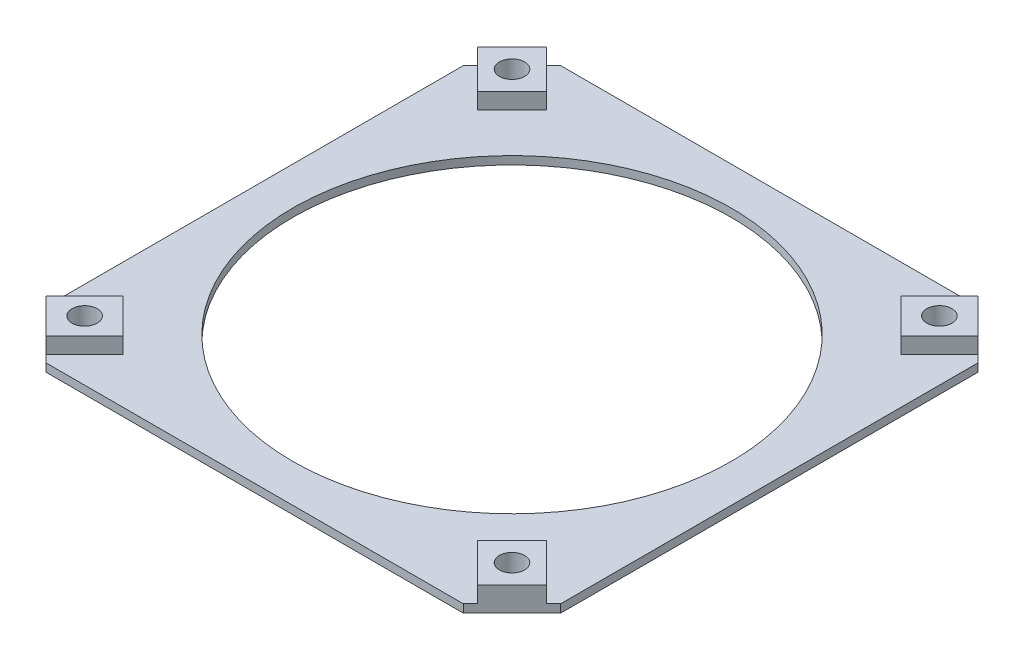
ISO-10303-21;
HEADER;
FILE_DESCRIPTION(('STEP AP214'),'2;1');
FILE_NAME('part.step','',(''),(''),'','','');
FILE_SCHEMA(('AUTOMOTIVE_DESIGN { 1 0 10303 214 1 1 1 1 }'));
ENDSEC;
DATA;
#1=APPLICATION_CONTEXT('core data for automotive mechanical design processes');
#2=APPLICATION_PROTOCOL_DEFINITION('international standard','automotive_design',2000,#1);
#3=PRODUCT_CONTEXT('',#1,'mechanical');
#4=PRODUCT('Part','Part','',(#3));
#5=PRODUCT_RELATED_PRODUCT_CATEGORY('part','',(#4));
#6=PRODUCT_DEFINITION_FORMATION('','',#4);
#7=PRODUCT_DEFINITION_CONTEXT('part definition',#1,'design');
#8=PRODUCT_DEFINITION('design','',#6,#7);
#9=PRODUCT_DEFINITION_SHAPE('','',#8);
#10=(LENGTH_UNIT() NAMED_UNIT(*) SI_UNIT(.MILLI.,.METRE.));
#11=(NAMED_UNIT(*) PLANE_ANGLE_UNIT() SI_UNIT($,.RADIAN.));
#12=(NAMED_UNIT(*) SI_UNIT($,.STERADIAN.) SOLID_ANGLE_UNIT());
#13=UNCERTAINTY_MEASURE_WITH_UNIT(LENGTH_MEASURE(1.E-05),#10,'distance_accuracy_value','');
#14=(GEOMETRIC_REPRESENTATION_CONTEXT(3) GLOBAL_UNCERTAINTY_ASSIGNED_CONTEXT((#13)) GLOBAL_UNIT_ASSIGNED_CONTEXT((#10,
#11,#12)) REPRESENTATION_CONTEXT('',''));
#15=CARTESIAN_POINT('',(0.,0.,0.));
#16=DIRECTION('',(0.,0.,1.));
#17=DIRECTION('',(1.,0.,0.));
#18=AXIS2_PLACEMENT_3D('',#15,#16,#17);
#19=CARTESIAN_POINT('',(0.,1.,0.));
#20=DIRECTION('',(0.,1.,0.));
#21=DIRECTION('',(0.,0.,1.));
#22=AXIS2_PLACEMENT_3D('',#19,#20,#21);
#23=PLANE('',#22);
#24=CARTESIAN_POINT('',(0.,1.,0.));
#25=DIRECTION('',(0.,1.,0.));
#26=DIRECTION('',(0.,0.,1.));
#27=AXIS2_PLACEMENT_3D('',#24,#25,#26);
#28=CIRCLE('',#27,27.);
#29=CARTESIAN_POINT('',(0.,1.,27.));
#30=VERTEX_POINT('',#29);
#31=EDGE_CURVE('E320',#30,#30,#28,.T.);
#32=ORIENTED_EDGE('',*,*,#31,.F.);
#33=EDGE_LOOP('',(#32));
#34=FACE_BOUND('',#33,.T.);
#35=DIRECTION('',(0.707106781186556,0.,-0.707106781186539));
#36=VECTOR('',#35,1.);
#37=CARTESIAN_POINT('',(-21.8074241767192,1.,-26.050064863839));
#38=LINE('',#37,#36);
#39=CARTESIAN_POINT('',(-26.0500648638386,1.,-21.8074241767198));
#40=VERTEX_POINT('',#39);
#41=CARTESIAN_POINT('',(-21.8074241767192,1.,-26.050064863839));
#42=VERTEX_POINT('',#41);
#43=EDGE_CURVE('E56',#40,#42,#38,.T.);
#44=ORIENTED_EDGE('',*,*,#43,.F.);
#45=DIRECTION('',(0.707106781186541,0.,0.707106781186554));
#46=VECTOR('',#45,1.);
#47=CARTESIAN_POINT('',(-30.8013203435594,1.,-26.5586796564407));
#48=LINE('',#47,#46);
#49=CARTESIAN_POINT('',(-30.8013203435594,1.,-26.5586796564407));
#50=VERTEX_POINT('',#49);
#51=EDGE_CURVE('E401',#50,#40,#48,.T.);
#52=ORIENTED_EDGE('',*,*,#51,.F.);
#53=DIRECTION('',(-0.707106781186548,0.,0.707106781186548));
#54=VECTOR('',#53,1.);
#55=CARTESIAN_POINT('',(-25.68,1.,-31.68));
#56=LINE('',#55,#54);
#57=CARTESIAN_POINT('',(-31.68,1.,-25.68));
#58=VERTEX_POINT('',#57);
#59=EDGE_CURVE('E223',#50,#58,#56,.T.);
#60=ORIENTED_EDGE('',*,*,#59,.T.);
#61=DIRECTION('',(0.,0.,1.));
#62=VECTOR('',#61,1.);
#63=CARTESIAN_POINT('',(-31.68,1.,25.68));
#64=LINE('',#63,#62);
#65=CARTESIAN_POINT('',(-31.68,1.,25.68));
#66=VERTEX_POINT('',#65);
#67=EDGE_CURVE('E337',#58,#66,#64,.T.);
#68=ORIENTED_EDGE('',*,*,#67,.T.);
#69=DIRECTION('',(0.707106781186548,0.,0.707106781186548));
#70=VECTOR('',#69,1.);
#71=CARTESIAN_POINT('',(-25.68,1.,31.68));
#72=LINE('',#71,#70);
#73=CARTESIAN_POINT('',(-30.8013203435598,1.,26.5586796564402));
#74=VERTEX_POINT('',#73);
#75=EDGE_CURVE('E340',#66,#74,#72,.T.);
#76=ORIENTED_EDGE('',*,*,#75,.T.);
#77=DIRECTION('',(-0.707106781186553,0.,0.707106781186542));
#78=VECTOR('',#77,1.);
#79=CARTESIAN_POINT('',(-30.8013203435598,1.,26.5586796564401));
#80=LINE('',#79,#78);
#81=CARTESIAN_POINT('',(-26.0500648638389,1.,21.8074241767193));
#82=VERTEX_POINT('',#81);
#83=EDGE_CURVE('E237',#82,#74,#80,.T.);
#84=ORIENTED_EDGE('',*,*,#83,.F.);
#85=DIRECTION('',(-0.707106781186542,0.,-0.707106781186553));
#86=VECTOR('',#85,1.);
#87=CARTESIAN_POINT('',(-26.0500648638389,1.,21.8074241767193));
#88=LINE('',#87,#86);
#89=CARTESIAN_POINT('',(-21.8074241767197,1.,26.0500648638386));
#90=VERTEX_POINT('',#89);
#91=EDGE_CURVE('E227',#90,#82,#88,.T.);
#92=ORIENTED_EDGE('',*,*,#91,.F.);
#93=DIRECTION('',(0.707106781186552,0.,-0.707106781186543));
#94=VECTOR('',#93,1.);
#95=CARTESIAN_POINT('',(-26.5586796564406,1.,30.8013203435595));
#96=LINE('',#95,#94);
#97=CARTESIAN_POINT('',(-26.5586796564406,1.,30.8013203435595));
#98=VERTEX_POINT('',#97);
#99=EDGE_CURVE('E224',#98,#90,#96,.T.);
#100=ORIENTED_EDGE('',*,*,#99,.F.);
#101=CARTESIAN_POINT('',(-25.68,1.,31.68));
#102=VERTEX_POINT('',#101);
#103=EDGE_CURVE('E339',#98,#102,#72,.T.);
#104=ORIENTED_EDGE('',*,*,#103,.T.);
#105=DIRECTION('',(1.,0.,0.));
#106=VECTOR('',#105,1.);
#107=CARTESIAN_POINT('',(25.68,1.,31.68));
#108=LINE('',#107,#106);
#109=CARTESIAN_POINT('',(25.68,1.,31.68));
#110=VERTEX_POINT('',#109);
#111=EDGE_CURVE('E342',#102,#110,#108,.T.);
#112=ORIENTED_EDGE('',*,*,#111,.T.);
#113=DIRECTION('',(0.707106781186548,0.,-0.707106781186548));
#114=VECTOR('',#113,1.);
#115=CARTESIAN_POINT('',(31.68,1.,25.68));
#116=LINE('',#115,#114);
#117=CARTESIAN_POINT('',(26.5586796564403,1.,30.8013203435597));
#118=VERTEX_POINT('',#117);
#119=EDGE_CURVE('E345',#110,#118,#116,.T.);
#120=ORIENTED_EDGE('',*,*,#119,.T.);
#121=DIRECTION('',(0.707106781186545,0.,0.70710678118655));
#122=VECTOR('',#121,1.);
#123=CARTESIAN_POINT('',(26.5586796564403,1.,30.8013203435597));
#124=LINE('',#123,#122);
#125=CARTESIAN_POINT('',(21.8074241767194,1.,26.0500648638388));
#126=VERTEX_POINT('',#125);
#127=EDGE_CURVE('E264',#126,#118,#124,.T.);
#128=ORIENTED_EDGE('',*,*,#127,.F.);
#129=DIRECTION('',(-0.70710678118655,0.,0.707106781186545));
#130=VECTOR('',#129,1.);
#131=CARTESIAN_POINT('',(21.8074241767194,1.,26.0500648638388));
#132=LINE('',#131,#130);
#133=CARTESIAN_POINT('',(26.0500648638387,1.,21.8074241767196));
#134=VERTEX_POINT('',#133);
#135=EDGE_CURVE('E273',#134,#126,#132,.T.);
#136=ORIENTED_EDGE('',*,*,#135,.F.);
#137=DIRECTION('',(-0.707106781186545,0.,-0.70710678118655));
#138=VECTOR('',#137,1.);
#139=CARTESIAN_POINT('',(30.8013203435596,1.,26.5586796564405));
#140=LINE('',#139,#138);
#141=CARTESIAN_POINT('',(30.8013203435596,1.,26.5586796564405));
#142=VERTEX_POINT('',#141);
#143=EDGE_CURVE('E259',#142,#134,#140,.T.);
#144=ORIENTED_EDGE('',*,*,#143,.F.);
#145=CARTESIAN_POINT('',(31.68,1.,25.68));
#146=VERTEX_POINT('',#145);
#147=EDGE_CURVE('E344',#142,#146,#116,.T.);
#148=ORIENTED_EDGE('',*,*,#147,.T.);
#149=DIRECTION('',(0.,0.,-1.));
#150=VECTOR('',#149,1.);
#151=CARTESIAN_POINT('',(31.68,1.,25.68));
#152=LINE('',#151,#150);
#153=CARTESIAN_POINT('',(31.68,1.,-25.68));
#154=VERTEX_POINT('',#153);
#155=EDGE_CURVE('E326',#146,#154,#152,.T.);
#156=ORIENTED_EDGE('',*,*,#155,.T.);
#157=DIRECTION('',(-0.707106781186548,0.,-0.707106781186548));
#158=VECTOR('',#157,1.);
#159=CARTESIAN_POINT('',(31.68,1.,-25.68));
#160=LINE('',#159,#158);
#161=CARTESIAN_POINT('',(30.8013203435596,1.,-26.5586796564404));
#162=VERTEX_POINT('',#161);
#163=EDGE_CURVE('E331',#154,#162,#160,.T.);
#164=ORIENTED_EDGE('',*,*,#163,.T.);
#165=DIRECTION('',(0.707106781186548,0.,-0.707106781186547));
#166=VECTOR('',#165,1.);
#167=CARTESIAN_POINT('',(30.8013203435596,1.,-26.5586796564404));
#168=LINE('',#167,#166);
#169=CARTESIAN_POINT('',(26.0500648638388,1.,-21.8074241767195));
#170=VERTEX_POINT('',#169);
#171=EDGE_CURVE('E294',#170,#162,#168,.T.);
#172=ORIENTED_EDGE('',*,*,#171,.F.);
#173=DIRECTION('',(0.707106781186547,0.,0.707106781186548));
#174=VECTOR('',#173,1.);
#175=CARTESIAN_POINT('',(26.0500648638388,1.,-21.8074241767195));
#176=LINE('',#175,#174);
#177=CARTESIAN_POINT('',(21.8074241767195,1.,-26.0500648638388));
#178=VERTEX_POINT('',#177);
#179=EDGE_CURVE('E303',#178,#170,#176,.T.);
#180=ORIENTED_EDGE('',*,*,#179,.F.);
#181=DIRECTION('',(-0.707106781186547,0.,0.707106781186548));
#182=VECTOR('',#181,1.);
#183=CARTESIAN_POINT('',(26.5586796564403,1.,-30.8013203435596));
#184=LINE('',#183,#182);
#185=CARTESIAN_POINT('',(26.5586796564403,1.,-30.8013203435597));
#186=VERTEX_POINT('',#185);
#187=EDGE_CURVE('E289',#186,#178,#184,.T.);
#188=ORIENTED_EDGE('',*,*,#187,.F.);
#189=CARTESIAN_POINT('',(25.68,1.,-31.68));
#190=VERTEX_POINT('',#189);
#191=EDGE_CURVE('E329',#186,#190,#160,.T.);
#192=ORIENTED_EDGE('',*,*,#191,.T.);
#193=DIRECTION('',(-1.,0.,0.));
#194=VECTOR('',#193,1.);
#195=CARTESIAN_POINT('',(25.68,1.,-31.68));
#196=LINE('',#195,#194);
#197=CARTESIAN_POINT('',(-25.68,1.,-31.68));
#198=VERTEX_POINT('',#197);
#199=EDGE_CURVE('E333',#190,#198,#196,.T.);
#200=ORIENTED_EDGE('',*,*,#199,.T.);
#201=CARTESIAN_POINT('',(-26.5586796564401,1.,-30.8013203435599));
#202=VERTEX_POINT('',#201);
#203=EDGE_CURVE('E335',#198,#202,#56,.T.);
#204=ORIENTED_EDGE('',*,*,#203,.T.);
#205=DIRECTION('',(-0.70710678118654,0.,-0.707106781186555));
#206=VECTOR('',#205,1.);
#207=CARTESIAN_POINT('',(-26.55867965644,1.,-30.8013203435599));
#208=LINE('',#207,#206);
#209=EDGE_CURVE('E61',#42,#202,#208,.T.);
#210=ORIENTED_EDGE('',*,*,#209,.F.);
#211=EDGE_LOOP('',(#44,#52,#60,#68,#76,#84,#92,#100,#104,#112,#120,#128,#136,#144,#148,#156,
#164,#172,#180,#188,#192,#200,#204,#210));
#212=FACE_BOUND('',#211,.T.);
#213=ADVANCED_FACE('F41',(#34,#212),#23,.T.);
#214=CARTESIAN_POINT('',(0.,0.,0.));
#215=DIRECTION('',(0.,1.,0.));
#216=DIRECTION('',(0.,0.,1.));
#217=AXIS2_PLACEMENT_3D('',#214,#215,#216);
#218=PLANE('',#217);
#219=CARTESIAN_POINT('',(-26.3043722601396,0.,26.3043722601396));
#220=DIRECTION('',(0.,1.,0.));
#221=DIRECTION('',(0.,0.,-1.));
#222=AXIS2_PLACEMENT_3D('',#219,#220,#221);
#223=CIRCLE('',#222,1.55);
#224=CARTESIAN_POINT('',(-26.3043722601396,0.,24.7543722601396));
#225=VERTEX_POINT('',#224);
#226=EDGE_CURVE('E432',#225,#225,#223,.T.);
#227=ORIENTED_EDGE('',*,*,#226,.T.);
#228=EDGE_LOOP('',(#227));
#229=FACE_BOUND('',#228,.T.);
#230=CARTESIAN_POINT('',(26.3043722601398,0.,26.3043722601393));
#231=DIRECTION('',(0.,1.,0.));
#232=DIRECTION('',(-1.,0.,0.));
#233=AXIS2_PLACEMENT_3D('',#230,#231,#232);
#234=CIRCLE('',#233,1.55);
#235=CARTESIAN_POINT('',(24.7543722601398,0.,26.3043722601393));
#236=VERTEX_POINT('',#235);
#237=EDGE_CURVE('E433',#236,#236,#234,.T.);
#238=ORIENTED_EDGE('',*,*,#237,.T.);
#239=EDGE_LOOP('',(#238));
#240=FACE_BOUND('',#239,.T.);
#241=CARTESIAN_POINT('',(-26.3043722601397,0.,-26.3043722601395));
#242=DIRECTION('',(0.,1.,0.));
#243=DIRECTION('',(1.,0.,0.));
#244=AXIS2_PLACEMENT_3D('',#241,#242,#243);
#245=CIRCLE('',#244,1.55);
#246=CARTESIAN_POINT('',(-24.7543722601397,0.,-26.3043722601395));
#247=VERTEX_POINT('',#246);
#248=EDGE_CURVE('E425',#247,#247,#245,.T.);
#249=ORIENTED_EDGE('',*,*,#248,.T.);
#250=EDGE_LOOP('',(#249));
#251=FACE_BOUND('',#250,.T.);
#252=CARTESIAN_POINT('',(26.3043722601396,0.,-26.3043722601396));
#253=DIRECTION('',(0.,1.,0.));
#254=DIRECTION('',(0.,0.,1.));
#255=AXIS2_PLACEMENT_3D('',#252,#253,#254);
#256=CIRCLE('',#255,1.55);
#257=CARTESIAN_POINT('',(26.3043722601396,0.,-24.7543722601396));
#258=VERTEX_POINT('',#257);
#259=EDGE_CURVE('E402',#258,#258,#256,.T.);
#260=ORIENTED_EDGE('',*,*,#259,.T.);
#261=EDGE_LOOP('',(#260));
#262=FACE_BOUND('',#261,.T.);
#263=DIRECTION('',(0.,0.,-1.));
#264=VECTOR('',#263,1.);
#265=CARTESIAN_POINT('',(31.68,0.,25.68));
#266=LINE('',#265,#264);
#267=CARTESIAN_POINT('',(31.68,0.,25.68));
#268=VERTEX_POINT('',#267);
#269=CARTESIAN_POINT('',(31.68,0.,-25.68));
#270=VERTEX_POINT('',#269);
#271=EDGE_CURVE('E323',#268,#270,#266,.T.);
#272=ORIENTED_EDGE('',*,*,#271,.F.);
#273=DIRECTION('',(0.707106781186548,0.,-0.707106781186548));
#274=VECTOR('',#273,1.);
#275=CARTESIAN_POINT('',(31.68,0.,25.68));
#276=LINE('',#275,#274);
#277=CARTESIAN_POINT('',(25.68,0.,31.68));
#278=VERTEX_POINT('',#277);
#279=EDGE_CURVE('E330',#278,#268,#276,.T.);
#280=ORIENTED_EDGE('',*,*,#279,.F.);
#281=DIRECTION('',(1.,0.,0.));
#282=VECTOR('',#281,1.);
#283=CARTESIAN_POINT('',(25.68,0.,31.68));
#284=LINE('',#283,#282);
#285=CARTESIAN_POINT('',(-25.68,0.,31.68));
#286=VERTEX_POINT('',#285);
#287=EDGE_CURVE('E360',#286,#278,#284,.T.);
#288=ORIENTED_EDGE('',*,*,#287,.F.);
#289=DIRECTION('',(0.707106781186548,0.,0.707106781186548));
#290=VECTOR('',#289,1.);
#291=CARTESIAN_POINT('',(-25.68,0.,31.68));
#292=LINE('',#291,#290);
#293=CARTESIAN_POINT('',(-31.68,0.,25.68));
#294=VERTEX_POINT('',#293);
#295=EDGE_CURVE('E358',#294,#286,#292,.T.);
#296=ORIENTED_EDGE('',*,*,#295,.F.);
#297=DIRECTION('',(0.,0.,1.));
#298=VECTOR('',#297,1.);
#299=CARTESIAN_POINT('',(-31.68,0.,25.68));
#300=LINE('',#299,#298);
#301=CARTESIAN_POINT('',(-31.68,0.,-25.68));
#302=VERTEX_POINT('',#301);
#303=EDGE_CURVE('E356',#302,#294,#300,.T.);
#304=ORIENTED_EDGE('',*,*,#303,.F.);
#305=DIRECTION('',(-0.707106781186548,0.,0.707106781186548));
#306=VECTOR('',#305,1.);
#307=CARTESIAN_POINT('',(-25.68,0.,-31.68));
#308=LINE('',#307,#306);
#309=CARTESIAN_POINT('',(-25.68,0.,-31.68));
#310=VERTEX_POINT('',#309);
#311=EDGE_CURVE('E354',#310,#302,#308,.T.);
#312=ORIENTED_EDGE('',*,*,#311,.F.);
#313=DIRECTION('',(-1.,0.,0.));
#314=VECTOR('',#313,1.);
#315=CARTESIAN_POINT('',(25.68,0.,-31.68));
#316=LINE('',#315,#314);
#317=CARTESIAN_POINT('',(25.68,0.,-31.68));
#318=VERTEX_POINT('',#317);
#319=EDGE_CURVE('E352',#318,#310,#316,.T.);
#320=ORIENTED_EDGE('',*,*,#319,.F.);
#321=DIRECTION('',(-0.707106781186548,0.,-0.707106781186548));
#322=VECTOR('',#321,1.);
#323=CARTESIAN_POINT('',(31.68,0.,-25.68));
#324=LINE('',#323,#322);
#325=EDGE_CURVE('E350',#270,#318,#324,.T.);
#326=ORIENTED_EDGE('',*,*,#325,.F.);
#327=EDGE_LOOP('',(#272,#280,#288,#296,#304,#312,#320,#326));
#328=FACE_BOUND('',#327,.T.);
#329=CARTESIAN_POINT('',(0.,0.,0.));
#330=DIRECTION('',(0.,1.,0.));
#331=DIRECTION('',(0.,0.,1.));
#332=AXIS2_PLACEMENT_3D('',#329,#330,#331);
#333=CIRCLE('',#332,27.);
#334=CARTESIAN_POINT('',(0.,0.,27.));
#335=VERTEX_POINT('',#334);
#336=EDGE_CURVE('E319',#335,#335,#333,.T.);
#337=ORIENTED_EDGE('',*,*,#336,.T.);
#338=EDGE_LOOP('',(#337));
#339=FACE_BOUND('',#338,.T.);
#340=ADVANCED_FACE('F391',(#229,#240,#251,#262,#328,#339),#218,.F.);
#341=CARTESIAN_POINT('',(31.68,1.,25.68));
#342=DIRECTION('',(-1.,0.,0.));
#343=DIRECTION('',(0.,0.,1.));
#344=AXIS2_PLACEMENT_3D('',#341,#342,#343);
#345=PLANE('',#344);
#346=ORIENTED_EDGE('',*,*,#271,.T.);
#347=DIRECTION('',(0.,-1.,0.));
#348=VECTOR('',#347,1.);
#349=CARTESIAN_POINT('',(31.68,1.,-25.68));
#350=LINE('',#349,#348);
#351=EDGE_CURVE('E11',#154,#270,#350,.T.);
#352=ORIENTED_EDGE('',*,*,#351,.F.);
#353=ORIENTED_EDGE('',*,*,#155,.F.);
#354=DIRECTION('',(0.,-1.,0.));
#355=VECTOR('',#354,1.);
#356=CARTESIAN_POINT('',(31.68,1.,25.68));
#357=LINE('',#356,#355);
#358=EDGE_CURVE('E347',#146,#268,#357,.T.);
#359=ORIENTED_EDGE('',*,*,#358,.T.);
#360=EDGE_LOOP('',(#346,#352,#353,#359));
#361=FACE_BOUND('',#360,.T.);
#362=ADVANCED_FACE('F43',(#361),#345,.F.);
#363=CARTESIAN_POINT('',(31.68,1.,-25.68));
#364=DIRECTION('',(-0.707106781186547,0.,0.707106781186547));
#365=DIRECTION('',(0.707106781186548,0.,0.707106781186548));
#366=AXIS2_PLACEMENT_3D('',#363,#364,#365);
#367=PLANE('',#366);
#368=ORIENTED_EDGE('',*,*,#325,.T.);
#369=DIRECTION('',(0.,-1.,0.));
#370=VECTOR('',#369,1.);
#371=CARTESIAN_POINT('',(25.68,1.,-31.68));
#372=LINE('',#371,#370);
#373=EDGE_CURVE('E49',#190,#318,#372,.T.);
#374=ORIENTED_EDGE('',*,*,#373,.F.);
#375=ORIENTED_EDGE('',*,*,#191,.F.);
#376=DIRECTION('',(0.,-1.,0.));
#377=VECTOR('',#376,1.);
#378=CARTESIAN_POINT('',(26.5586796564403,3.,-30.8013203435596));
#379=LINE('',#378,#377);
#380=CARTESIAN_POINT('',(26.5586796564403,3.,-30.8013203435596));
#381=VERTEX_POINT('',#380);
#382=EDGE_CURVE('E316',#381,#186,#379,.T.);
#383=ORIENTED_EDGE('',*,*,#382,.F.);
#384=DIRECTION('',(-0.707106781186548,0.,-0.707106781186547));
#385=VECTOR('',#384,1.);
#386=CARTESIAN_POINT('',(30.8013203435596,3.,-26.5586796564404));
#387=LINE('',#386,#385);
#388=CARTESIAN_POINT('',(30.8013203435596,3.,-26.5586796564404));
#389=VERTEX_POINT('',#388);
#390=EDGE_CURVE('E290',#389,#381,#387,.T.);
#391=ORIENTED_EDGE('',*,*,#390,.F.);
#392=DIRECTION('',(0.,-1.,0.));
#393=VECTOR('',#392,1.);
#394=CARTESIAN_POINT('',(30.8013203435596,3.,-26.5586796564404));
#395=LINE('',#394,#393);
#396=EDGE_CURVE('E300',#389,#162,#395,.T.);
#397=ORIENTED_EDGE('',*,*,#396,.T.);
#398=ORIENTED_EDGE('',*,*,#163,.F.);
#399=ORIENTED_EDGE('',*,*,#351,.T.);
#400=EDGE_LOOP('',(#368,#374,#375,#383,#391,#397,#398,#399));
#401=FACE_BOUND('',#400,.T.);
#402=ADVANCED_FACE('F499',(#401),#367,.F.);
#403=CARTESIAN_POINT('',(25.68,1.,-31.68));
#404=DIRECTION('',(0.,0.,1.));
#405=DIRECTION('',(1.,0.,0.));
#406=AXIS2_PLACEMENT_3D('',#403,#404,#405);
#407=PLANE('',#406);
#408=ORIENTED_EDGE('',*,*,#319,.T.);
#409=DIRECTION('',(0.,-1.,0.));
#410=VECTOR('',#409,1.);
#411=CARTESIAN_POINT('',(-25.68,1.,-31.68));
#412=LINE('',#411,#410);
#413=EDGE_CURVE('E377',#198,#310,#412,.T.);
#414=ORIENTED_EDGE('',*,*,#413,.F.);
#415=ORIENTED_EDGE('',*,*,#199,.F.);
#416=ORIENTED_EDGE('',*,*,#373,.T.);
#417=EDGE_LOOP('',(#408,#414,#415,#416));
#418=FACE_BOUND('',#417,.T.);
#419=ADVANCED_FACE('F384',(#418),#407,.F.);
#420=CARTESIAN_POINT('',(-25.68,1.,-31.68));
#421=DIRECTION('',(0.707106781186547,0.,0.707106781186547));
#422=DIRECTION('',(0.707106781186548,0.,-0.707106781186548));
#423=AXIS2_PLACEMENT_3D('',#420,#421,#422);
#424=PLANE('',#423);
#425=ORIENTED_EDGE('',*,*,#311,.T.);
#426=DIRECTION('',(0.,-1.,0.));
#427=VECTOR('',#426,1.);
#428=CARTESIAN_POINT('',(-31.68,1.,-25.68));
#429=LINE('',#428,#427);
#430=EDGE_CURVE('E374',#58,#302,#429,.T.);
#431=ORIENTED_EDGE('',*,*,#430,.F.);
#432=ORIENTED_EDGE('',*,*,#59,.F.);
#433=DIRECTION('',(0.,-1.,0.));
#434=VECTOR('',#433,1.);
#435=CARTESIAN_POINT('',(-30.8013203435594,3.,-26.5586796564407));
#436=LINE('',#435,#434);
#437=CARTESIAN_POINT('',(-30.8013203435594,3.,-26.5586796564407));
#438=VERTEX_POINT('',#437);
#439=EDGE_CURVE('E205',#438,#50,#436,.T.);
#440=ORIENTED_EDGE('',*,*,#439,.F.);
#441=DIRECTION('',(-0.707106781186554,0.,0.707106781186541));
#442=VECTOR('',#441,1.);
#443=CARTESIAN_POINT('',(-26.55867965644,3.,-30.8013203435599));
#444=LINE('',#443,#442);
#445=CARTESIAN_POINT('',(-26.55867965644,3.,-30.8013203435599));
#446=VERTEX_POINT('',#445);
#447=EDGE_CURVE('E211',#446,#438,#444,.T.);
#448=ORIENTED_EDGE('',*,*,#447,.F.);
#449=DIRECTION('',(0.,-1.,0.));
#450=VECTOR('',#449,1.);
#451=CARTESIAN_POINT('',(-26.55867965644,3.,-30.8013203435599));
#452=LINE('',#451,#450);
#453=EDGE_CURVE('E412',#446,#202,#452,.T.);
#454=ORIENTED_EDGE('',*,*,#453,.T.);
#455=ORIENTED_EDGE('',*,*,#203,.F.);
#456=ORIENTED_EDGE('',*,*,#413,.T.);
#457=EDGE_LOOP('',(#425,#431,#432,#440,#448,#454,#455,#456));
#458=FACE_BOUND('',#457,.T.);
#459=ADVANCED_FACE('F221',(#458),#424,.F.);
#460=CARTESIAN_POINT('',(-31.68,1.,25.68));
#461=DIRECTION('',(1.,0.,0.));
#462=DIRECTION('',(0.,0.,-1.));
#463=AXIS2_PLACEMENT_3D('',#460,#461,#462);
#464=PLANE('',#463);
#465=ORIENTED_EDGE('',*,*,#303,.T.);
#466=DIRECTION('',(0.,-1.,0.));
#467=VECTOR('',#466,1.);
#468=CARTESIAN_POINT('',(-31.68,1.,25.68));
#469=LINE('',#468,#467);
#470=EDGE_CURVE('E371',#66,#294,#469,.T.);
#471=ORIENTED_EDGE('',*,*,#470,.F.);
#472=ORIENTED_EDGE('',*,*,#67,.F.);
#473=ORIENTED_EDGE('',*,*,#430,.T.);
#474=EDGE_LOOP('',(#465,#471,#472,#473));
#475=FACE_BOUND('',#474,.T.);
#476=ADVANCED_FACE('F398',(#475),#464,.F.);
#477=CARTESIAN_POINT('',(-25.68,1.,31.68));
#478=DIRECTION('',(0.707106781186547,0.,-0.707106781186547));
#479=DIRECTION('',(-0.707106781186548,0.,-0.707106781186548));
#480=AXIS2_PLACEMENT_3D('',#477,#478,#479);
#481=PLANE('',#480);
#482=ORIENTED_EDGE('',*,*,#295,.T.);
#483=DIRECTION('',(0.,-1.,0.));
#484=VECTOR('',#483,1.);
#485=CARTESIAN_POINT('',(-25.68,1.,31.68));
#486=LINE('',#485,#484);
#487=EDGE_CURVE('E368',#102,#286,#486,.T.);
#488=ORIENTED_EDGE('',*,*,#487,.F.);
#489=ORIENTED_EDGE('',*,*,#103,.F.);
#490=DIRECTION('',(0.,-1.,0.));
#491=VECTOR('',#490,1.);
#492=CARTESIAN_POINT('',(-26.5586796564406,3.,30.8013203435595));
#493=LINE('',#492,#491);
#494=CARTESIAN_POINT('',(-26.5586796564406,3.,30.8013203435595));
#495=VERTEX_POINT('',#494);
#496=EDGE_CURVE('E256',#495,#98,#493,.T.);
#497=ORIENTED_EDGE('',*,*,#496,.F.);
#498=DIRECTION('',(0.707106781186543,0.,0.707106781186552));
#499=VECTOR('',#498,1.);
#500=CARTESIAN_POINT('',(-30.8013203435598,3.,26.5586796564401));
#501=LINE('',#500,#499);
#502=CARTESIAN_POINT('',(-30.8013203435598,3.,26.5586796564401));
#503=VERTEX_POINT('',#502);
#504=EDGE_CURVE('E233',#503,#495,#501,.T.);
#505=ORIENTED_EDGE('',*,*,#504,.F.);
#506=DIRECTION('',(0.,-1.,0.));
#507=VECTOR('',#506,1.);
#508=CARTESIAN_POINT('',(-30.8013203435598,3.,26.5586796564401));
#509=LINE('',#508,#507);
#510=EDGE_CURVE('E242',#503,#74,#509,.T.);
#511=ORIENTED_EDGE('',*,*,#510,.T.);
#512=ORIENTED_EDGE('',*,*,#75,.F.);
#513=ORIENTED_EDGE('',*,*,#470,.T.);
#514=EDGE_LOOP('',(#482,#488,#489,#497,#505,#511,#512,#513));
#515=FACE_BOUND('',#514,.T.);
#516=ADVANCED_FACE('F462',(#515),#481,.F.);
#517=CARTESIAN_POINT('',(25.68,1.,31.68));
#518=DIRECTION('',(0.,0.,-1.));
#519=DIRECTION('',(-1.,0.,0.));
#520=AXIS2_PLACEMENT_3D('',#517,#518,#519);
#521=PLANE('',#520);
#522=ORIENTED_EDGE('',*,*,#287,.T.);
#523=DIRECTION('',(0.,-1.,0.));
#524=VECTOR('',#523,1.);
#525=CARTESIAN_POINT('',(25.68,1.,31.68));
#526=LINE('',#525,#524);
#527=EDGE_CURVE('E365',#110,#278,#526,.T.);
#528=ORIENTED_EDGE('',*,*,#527,.F.);
#529=ORIENTED_EDGE('',*,*,#111,.F.);
#530=ORIENTED_EDGE('',*,*,#487,.T.);
#531=EDGE_LOOP('',(#522,#528,#529,#530));
#532=FACE_BOUND('',#531,.T.);
#533=ADVANCED_FACE('F476',(#532),#521,.F.);
#534=CARTESIAN_POINT('',(31.68,1.,25.68));
#535=DIRECTION('',(-0.707106781186547,0.,-0.707106781186547));
#536=DIRECTION('',(-0.707106781186548,0.,0.707106781186548));
#537=AXIS2_PLACEMENT_3D('',#534,#535,#536);
#538=PLANE('',#537);
#539=ORIENTED_EDGE('',*,*,#279,.T.);
#540=ORIENTED_EDGE('',*,*,#358,.F.);
#541=ORIENTED_EDGE('',*,*,#147,.F.);
#542=DIRECTION('',(0.,-1.,0.));
#543=VECTOR('',#542,1.);
#544=CARTESIAN_POINT('',(30.8013203435596,3.,26.5586796564405));
#545=LINE('',#544,#543);
#546=CARTESIAN_POINT('',(30.8013203435596,3.,26.5586796564405));
#547=VERTEX_POINT('',#546);
#548=EDGE_CURVE('E286',#547,#142,#545,.T.);
#549=ORIENTED_EDGE('',*,*,#548,.F.);
#550=DIRECTION('',(0.707106781186549,0.,-0.707106781186546));
#551=VECTOR('',#550,1.);
#552=CARTESIAN_POINT('',(26.5586796564403,3.,30.8013203435597));
#553=LINE('',#552,#551);
#554=CARTESIAN_POINT('',(26.5586796564403,3.,30.8013203435597));
#555=VERTEX_POINT('',#554);
#556=EDGE_CURVE('E260',#555,#547,#553,.T.);
#557=ORIENTED_EDGE('',*,*,#556,.F.);
#558=DIRECTION('',(0.,-1.,0.));
#559=VECTOR('',#558,1.);
#560=CARTESIAN_POINT('',(26.5586796564403,3.,30.8013203435597));
#561=LINE('',#560,#559);
#562=EDGE_CURVE('E270',#555,#118,#561,.T.);
#563=ORIENTED_EDGE('',*,*,#562,.T.);
#564=ORIENTED_EDGE('',*,*,#119,.F.);
#565=ORIENTED_EDGE('',*,*,#527,.T.);
#566=EDGE_LOOP('',(#539,#540,#541,#549,#557,#563,#564,#565));
#567=FACE_BOUND('',#566,.T.);
#568=ADVANCED_FACE('F480',(#567),#538,.F.);
#569=CARTESIAN_POINT('',(0.,1.,0.));
#570=DIRECTION('',(0.,-1.,0.));
#571=DIRECTION('',(0.,0.,-1.));
#572=AXIS2_PLACEMENT_3D('',#569,#570,#571);
#573=CYLINDRICAL_SURFACE('',#572,27.);
#574=ORIENTED_EDGE('',*,*,#31,.T.);
#575=EDGE_LOOP('',(#574));
#576=FACE_BOUND('',#575,.T.);
#577=ORIENTED_EDGE('',*,*,#336,.F.);
#578=EDGE_LOOP('',(#577));
#579=FACE_BOUND('',#578,.T.);
#580=ADVANCED_FACE('F538',(#576,#579),#573,.F.);
#581=CARTESIAN_POINT('',(26.5586796564403,3.,-30.8013203435596));
#582=DIRECTION('',(0.707106781186548,0.,0.707106781186547));
#583=DIRECTION('',(0.707106781186547,0.,-0.707106781186548));
#584=AXIS2_PLACEMENT_3D('',#581,#582,#583);
#585=PLANE('',#584);
#586=ORIENTED_EDGE('',*,*,#187,.T.);
#587=DIRECTION('',(0.,-1.,0.));
#588=VECTOR('',#587,1.);
#589=CARTESIAN_POINT('',(21.8074241767195,3.,-26.0500648638388));
#590=LINE('',#589,#588);
#591=CARTESIAN_POINT('',(21.8074241767195,3.,-26.0500648638388));
#592=VERTEX_POINT('',#591);
#593=EDGE_CURVE('E313',#592,#178,#590,.T.);
#594=ORIENTED_EDGE('',*,*,#593,.F.);
#595=DIRECTION('',(-0.707106781186547,0.,0.707106781186548));
#596=VECTOR('',#595,1.);
#597=CARTESIAN_POINT('',(26.5586796564403,3.,-30.8013203435596));
#598=LINE('',#597,#596);
#599=EDGE_CURVE('E293',#381,#592,#598,.T.);
#600=ORIENTED_EDGE('',*,*,#599,.F.);
#601=ORIENTED_EDGE('',*,*,#382,.T.);
#602=EDGE_LOOP('',(#586,#594,#600,#601));
#603=FACE_BOUND('',#602,.T.);
#604=ADVANCED_FACE('F512',(#603),#585,.F.);
#605=CARTESIAN_POINT('',(26.0500648638388,3.,-21.8074241767195));
#606=DIRECTION('',(0.707106781186548,0.,-0.707106781186547));
#607=DIRECTION('',(-0.707106781186547,0.,-0.707106781186548));
#608=AXIS2_PLACEMENT_3D('',#605,#606,#607);
#609=PLANE('',#608);
#610=ORIENTED_EDGE('',*,*,#179,.T.);
#611=DIRECTION('',(0.,-1.,0.));
#612=VECTOR('',#611,1.);
#613=CARTESIAN_POINT('',(26.0500648638388,3.,-21.8074241767195));
#614=LINE('',#613,#612);
#615=CARTESIAN_POINT('',(26.0500648638388,3.,-21.8074241767195));
#616=VERTEX_POINT('',#615);
#617=EDGE_CURVE('E310',#616,#170,#614,.T.);
#618=ORIENTED_EDGE('',*,*,#617,.F.);
#619=DIRECTION('',(0.707106781186547,0.,0.707106781186548));
#620=VECTOR('',#619,1.);
#621=CARTESIAN_POINT('',(26.0500648638388,3.,-21.8074241767195));
#622=LINE('',#621,#620);
#623=EDGE_CURVE('E296',#592,#616,#622,.T.);
#624=ORIENTED_EDGE('',*,*,#623,.F.);
#625=ORIENTED_EDGE('',*,*,#593,.T.);
#626=EDGE_LOOP('',(#610,#618,#624,#625));
#627=FACE_BOUND('',#626,.T.);
#628=ADVANCED_FACE('F508',(#627),#609,.F.);
#629=CARTESIAN_POINT('',(30.8013203435596,3.,-26.5586796564404));
#630=DIRECTION('',(-0.707106781186547,0.,-0.707106781186548));
#631=DIRECTION('',(-0.707106781186548,0.,0.707106781186547));
#632=AXIS2_PLACEMENT_3D('',#629,#630,#631);
#633=PLANE('',#632);
#634=ORIENTED_EDGE('',*,*,#171,.T.);
#635=ORIENTED_EDGE('',*,*,#396,.F.);
#636=DIRECTION('',(0.707106781186548,0.,-0.707106781186547));
#637=VECTOR('',#636,1.);
#638=CARTESIAN_POINT('',(30.8013203435596,3.,-26.5586796564404));
#639=LINE('',#638,#637);
#640=EDGE_CURVE('E298',#616,#389,#639,.T.);
#641=ORIENTED_EDGE('',*,*,#640,.F.);
#642=ORIENTED_EDGE('',*,*,#617,.T.);
#643=EDGE_LOOP('',(#634,#635,#641,#642));
#644=FACE_BOUND('',#643,.T.);
#645=ADVANCED_FACE('F505',(#644),#633,.F.);
#646=CARTESIAN_POINT('',(0.,3.,0.));
#647=DIRECTION('',(0.,1.,0.));
#648=DIRECTION('',(0.,0.,1.));
#649=AXIS2_PLACEMENT_3D('',#646,#647,#648);
#650=PLANE('',#649);
#651=CARTESIAN_POINT('',(26.3043722601396,3.,-26.3043722601396));
#652=DIRECTION('',(0.,1.,0.));
#653=DIRECTION('',(0.,0.,1.));
#654=AXIS2_PLACEMENT_3D('',#651,#652,#653);
#655=CIRCLE('',#654,1.55);
#656=CARTESIAN_POINT('',(26.3043722601396,3.,-24.7543722601396));
#657=VERTEX_POINT('',#656);
#658=EDGE_CURVE('E406',#657,#657,#655,.T.);
#659=ORIENTED_EDGE('',*,*,#658,.F.);
#660=EDGE_LOOP('',(#659));
#661=FACE_BOUND('',#660,.T.);
#662=ORIENTED_EDGE('',*,*,#390,.T.);
#663=ORIENTED_EDGE('',*,*,#599,.T.);
#664=ORIENTED_EDGE('',*,*,#623,.T.);
#665=ORIENTED_EDGE('',*,*,#640,.T.);
#666=EDGE_LOOP('',(#662,#663,#664,#665));
#667=FACE_BOUND('',#666,.T.);
#668=ADVANCED_FACE('F514',(#661,#667),#650,.T.);
#669=CARTESIAN_POINT('',(30.8013203435596,3.,26.5586796564405));
#670=DIRECTION('',(-0.70710678118655,0.,0.707106781186545));
#671=DIRECTION('',(0.707106781186545,0.,0.70710678118655));
#672=AXIS2_PLACEMENT_3D('',#669,#670,#671);
#673=PLANE('',#672);
#674=ORIENTED_EDGE('',*,*,#143,.T.);
#675=DIRECTION('',(0.,-1.,0.));
#676=VECTOR('',#675,1.);
#677=CARTESIAN_POINT('',(26.0500648638387,3.,21.8074241767196));
#678=LINE('',#677,#676);
#679=CARTESIAN_POINT('',(26.0500648638387,3.,21.8074241767196));
#680=VERTEX_POINT('',#679);
#681=EDGE_CURVE('E283',#680,#134,#678,.T.);
#682=ORIENTED_EDGE('',*,*,#681,.F.);
#683=DIRECTION('',(-0.707106781186545,0.,-0.70710678118655));
#684=VECTOR('',#683,1.);
#685=CARTESIAN_POINT('',(30.8013203435596,3.,26.5586796564405));
#686=LINE('',#685,#684);
#687=EDGE_CURVE('E263',#547,#680,#686,.T.);
#688=ORIENTED_EDGE('',*,*,#687,.F.);
#689=ORIENTED_EDGE('',*,*,#548,.T.);
#690=EDGE_LOOP('',(#674,#682,#688,#689));
#691=FACE_BOUND('',#690,.T.);
#692=ADVANCED_FACE('F494',(#691),#673,.F.);
#693=CARTESIAN_POINT('',(21.8074241767194,3.,26.0500648638388));
#694=DIRECTION('',(0.707106781186545,0.,0.70710678118655));
#695=DIRECTION('',(0.70710678118655,0.,-0.707106781186545));
#696=AXIS2_PLACEMENT_3D('',#693,#694,#695);
#697=PLANE('',#696);
#698=ORIENTED_EDGE('',*,*,#135,.T.);
#699=DIRECTION('',(0.,-1.,0.));
#700=VECTOR('',#699,1.);
#701=CARTESIAN_POINT('',(21.8074241767194,3.,26.0500648638388));
#702=LINE('',#701,#700);
#703=CARTESIAN_POINT('',(21.8074241767194,3.,26.0500648638388));
#704=VERTEX_POINT('',#703);
#705=EDGE_CURVE('E280',#704,#126,#702,.T.);
#706=ORIENTED_EDGE('',*,*,#705,.F.);
#707=DIRECTION('',(-0.70710678118655,0.,0.707106781186545));
#708=VECTOR('',#707,1.);
#709=CARTESIAN_POINT('',(21.8074241767194,3.,26.0500648638388));
#710=LINE('',#709,#708);
#711=EDGE_CURVE('E266',#680,#704,#710,.T.);
#712=ORIENTED_EDGE('',*,*,#711,.F.);
#713=ORIENTED_EDGE('',*,*,#681,.T.);
#714=EDGE_LOOP('',(#698,#706,#712,#713));
#715=FACE_BOUND('',#714,.T.);
#716=ADVANCED_FACE('F490',(#715),#697,.F.);
#717=CARTESIAN_POINT('',(26.5586796564403,3.,30.8013203435597));
#718=DIRECTION('',(0.70710678118655,0.,-0.707106781186545));
#719=DIRECTION('',(-0.707106781186545,0.,-0.70710678118655));
#720=AXIS2_PLACEMENT_3D('',#717,#718,#719);
#721=PLANE('',#720);
#722=ORIENTED_EDGE('',*,*,#127,.T.);
#723=ORIENTED_EDGE('',*,*,#562,.F.);
#724=DIRECTION('',(0.707106781186545,0.,0.70710678118655));
#725=VECTOR('',#724,1.);
#726=CARTESIAN_POINT('',(26.5586796564403,3.,30.8013203435597));
#727=LINE('',#726,#725);
#728=EDGE_CURVE('E268',#704,#555,#727,.T.);
#729=ORIENTED_EDGE('',*,*,#728,.F.);
#730=ORIENTED_EDGE('',*,*,#705,.T.);
#731=EDGE_LOOP('',(#722,#723,#729,#730));
#732=FACE_BOUND('',#731,.T.);
#733=ADVANCED_FACE('F485',(#732),#721,.F.);
#734=CARTESIAN_POINT('',(0.,3.,0.));
#735=DIRECTION('',(0.,1.,0.));
#736=DIRECTION('',(0.,0.,1.));
#737=AXIS2_PLACEMENT_3D('',#734,#735,#736);
#738=PLANE('',#737);
#739=CARTESIAN_POINT('',(26.3043722601398,3.,26.3043722601393));
#740=DIRECTION('',(0.,1.,0.));
#741=DIRECTION('',(-1.,0.,0.));
#742=AXIS2_PLACEMENT_3D('',#739,#740,#741);
#743=CIRCLE('',#742,1.55);
#744=CARTESIAN_POINT('',(24.7543722601398,3.,26.3043722601393));
#745=VERTEX_POINT('',#744);
#746=EDGE_CURVE('E429',#745,#745,#743,.T.);
#747=ORIENTED_EDGE('',*,*,#746,.F.);
#748=EDGE_LOOP('',(#747));
#749=FACE_BOUND('',#748,.T.);
#750=ORIENTED_EDGE('',*,*,#556,.T.);
#751=ORIENTED_EDGE('',*,*,#687,.T.);
#752=ORIENTED_EDGE('',*,*,#711,.T.);
#753=ORIENTED_EDGE('',*,*,#728,.T.);
#754=EDGE_LOOP('',(#750,#751,#752,#753));
#755=FACE_BOUND('',#754,.T.);
#756=ADVANCED_FACE('F637',(#749,#755),#738,.T.);
#757=CARTESIAN_POINT('',(-26.5586796564406,3.,30.8013203435595));
#758=DIRECTION('',(-0.707106781186543,0.,-0.707106781186552));
#759=DIRECTION('',(-0.707106781186552,0.,0.707106781186543));
#760=AXIS2_PLACEMENT_3D('',#757,#758,#759);
#761=PLANE('',#760);
#762=ORIENTED_EDGE('',*,*,#99,.T.);
#763=DIRECTION('',(0.,-1.,0.));
#764=VECTOR('',#763,1.);
#765=CARTESIAN_POINT('',(-21.8074241767197,3.,26.0500648638386));
#766=LINE('',#765,#764);
#767=CARTESIAN_POINT('',(-21.8074241767197,3.,26.0500648638386));
#768=VERTEX_POINT('',#767);
#769=EDGE_CURVE('E253',#768,#90,#766,.T.);
#770=ORIENTED_EDGE('',*,*,#769,.F.);
#771=DIRECTION('',(0.707106781186552,0.,-0.707106781186543));
#772=VECTOR('',#771,1.);
#773=CARTESIAN_POINT('',(-26.5586796564406,3.,30.8013203435595));
#774=LINE('',#773,#772);
#775=EDGE_CURVE('E236',#495,#768,#774,.T.);
#776=ORIENTED_EDGE('',*,*,#775,.F.);
#777=ORIENTED_EDGE('',*,*,#496,.T.);
#778=EDGE_LOOP('',(#762,#770,#776,#777));
#779=FACE_BOUND('',#778,.T.);
#780=ADVANCED_FACE('F466',(#779),#761,.F.);
#781=CARTESIAN_POINT('',(-26.0500648638389,3.,21.8074241767193));
#782=DIRECTION('',(-0.707106781186553,0.,0.707106781186542));
#783=DIRECTION('',(0.707106781186542,0.,0.707106781186553));
#784=AXIS2_PLACEMENT_3D('',#781,#782,#783);
#785=PLANE('',#784);
#786=ORIENTED_EDGE('',*,*,#91,.T.);
#787=DIRECTION('',(0.,-1.,0.));
#788=VECTOR('',#787,1.);
#789=CARTESIAN_POINT('',(-26.0500648638389,3.,21.8074241767193));
#790=LINE('',#789,#788);
#791=CARTESIAN_POINT('',(-26.0500648638389,3.,21.8074241767193));
#792=VERTEX_POINT('',#791);
#793=EDGE_CURVE('E250',#792,#82,#790,.T.);
#794=ORIENTED_EDGE('',*,*,#793,.F.);
#795=DIRECTION('',(-0.707106781186542,0.,-0.707106781186553));
#796=VECTOR('',#795,1.);
#797=CARTESIAN_POINT('',(-26.0500648638389,3.,21.8074241767193));
#798=LINE('',#797,#796);
#799=EDGE_CURVE('E239',#768,#792,#798,.T.);
#800=ORIENTED_EDGE('',*,*,#799,.F.);
#801=ORIENTED_EDGE('',*,*,#769,.T.);
#802=EDGE_LOOP('',(#786,#794,#800,#801));
#803=FACE_BOUND('',#802,.T.);
#804=ADVANCED_FACE('F470',(#803),#785,.F.);
#805=CARTESIAN_POINT('',(-30.8013203435598,3.,26.5586796564401));
#806=DIRECTION('',(0.707106781186542,0.,0.707106781186553));
#807=DIRECTION('',(0.707106781186553,0.,-0.707106781186542));
#808=AXIS2_PLACEMENT_3D('',#805,#806,#807);
#809=PLANE('',#808);
#810=ORIENTED_EDGE('',*,*,#83,.T.);
#811=ORIENTED_EDGE('',*,*,#510,.F.);
#812=DIRECTION('',(-0.707106781186553,0.,0.707106781186542));
#813=VECTOR('',#812,1.);
#814=CARTESIAN_POINT('',(-30.8013203435598,3.,26.5586796564401));
#815=LINE('',#814,#813);
#816=EDGE_CURVE('E241',#792,#503,#815,.T.);
#817=ORIENTED_EDGE('',*,*,#816,.F.);
#818=ORIENTED_EDGE('',*,*,#793,.T.);
#819=EDGE_LOOP('',(#810,#811,#817,#818));
#820=FACE_BOUND('',#819,.T.);
#821=ADVANCED_FACE('F454',(#820),#809,.F.);
#822=CARTESIAN_POINT('',(0.,3.,0.));
#823=DIRECTION('',(0.,1.,0.));
#824=DIRECTION('',(0.,0.,1.));
#825=AXIS2_PLACEMENT_3D('',#822,#823,#824);
#826=PLANE('',#825);
#827=CARTESIAN_POINT('',(-26.3043722601396,3.,26.3043722601396));
#828=DIRECTION('',(0.,1.,0.));
#829=DIRECTION('',(0.,0.,-1.));
#830=AXIS2_PLACEMENT_3D('',#827,#828,#829);
#831=CIRCLE('',#830,1.55);
#832=CARTESIAN_POINT('',(-26.3043722601396,3.,24.7543722601396));
#833=VERTEX_POINT('',#832);
#834=EDGE_CURVE('E428',#833,#833,#831,.T.);
#835=ORIENTED_EDGE('',*,*,#834,.F.);
#836=EDGE_LOOP('',(#835));
#837=FACE_BOUND('',#836,.T.);
#838=ORIENTED_EDGE('',*,*,#504,.T.);
#839=ORIENTED_EDGE('',*,*,#775,.T.);
#840=ORIENTED_EDGE('',*,*,#799,.T.);
#841=ORIENTED_EDGE('',*,*,#816,.T.);
#842=EDGE_LOOP('',(#838,#839,#840,#841));
#843=FACE_BOUND('',#842,.T.);
#844=ADVANCED_FACE('F451',(#837,#843),#826,.T.);
#845=CARTESIAN_POINT('',(-30.8013203435594,3.,-26.5586796564407));
#846=DIRECTION('',(0.707106781186554,0.,-0.707106781186541));
#847=DIRECTION('',(-0.707106781186541,0.,-0.707106781186554));
#848=AXIS2_PLACEMENT_3D('',#845,#846,#847);
#849=PLANE('',#848);
#850=ORIENTED_EDGE('',*,*,#51,.T.);
#851=DIRECTION('',(0.,-1.,0.));
#852=VECTOR('',#851,1.);
#853=CARTESIAN_POINT('',(-26.0500648638386,3.,-21.8074241767198));
#854=LINE('',#853,#852);
#855=CARTESIAN_POINT('',(-26.0500648638386,3.,-21.8074241767198));
#856=VERTEX_POINT('',#855);
#857=EDGE_CURVE('E207',#856,#40,#854,.T.);
#858=ORIENTED_EDGE('',*,*,#857,.F.);
#859=DIRECTION('',(0.707106781186541,0.,0.707106781186554));
#860=VECTOR('',#859,1.);
#861=CARTESIAN_POINT('',(-30.8013203435594,3.,-26.5586796564407));
#862=LINE('',#861,#860);
#863=EDGE_CURVE('E201',#438,#856,#862,.T.);
#864=ORIENTED_EDGE('',*,*,#863,.F.);
#865=ORIENTED_EDGE('',*,*,#439,.T.);
#866=EDGE_LOOP('',(#850,#858,#864,#865));
#867=FACE_BOUND('',#866,.T.);
#868=ADVANCED_FACE('F203',(#867),#849,.F.);
#869=CARTESIAN_POINT('',(-21.8074241767192,3.,-26.050064863839));
#870=DIRECTION('',(-0.707106781186539,0.,-0.707106781186556));
#871=DIRECTION('',(-0.707106781186556,0.,0.707106781186539));
#872=AXIS2_PLACEMENT_3D('',#869,#870,#871);
#873=PLANE('',#872);
#874=ORIENTED_EDGE('',*,*,#43,.T.);
#875=DIRECTION('',(0.,-1.,0.));
#876=VECTOR('',#875,1.);
#877=CARTESIAN_POINT('',(-21.8074241767192,3.,-26.050064863839));
#878=LINE('',#877,#876);
#879=CARTESIAN_POINT('',(-21.8074241767192,3.,-26.050064863839));
#880=VERTEX_POINT('',#879);
#881=EDGE_CURVE('E229',#880,#42,#878,.T.);
#882=ORIENTED_EDGE('',*,*,#881,.F.);
#883=DIRECTION('',(0.707106781186556,0.,-0.707106781186539));
#884=VECTOR('',#883,1.);
#885=CARTESIAN_POINT('',(-21.8074241767192,3.,-26.050064863839));
#886=LINE('',#885,#884);
#887=EDGE_CURVE('E210',#856,#880,#886,.T.);
#888=ORIENTED_EDGE('',*,*,#887,.F.);
#889=ORIENTED_EDGE('',*,*,#857,.T.);
#890=EDGE_LOOP('',(#874,#882,#888,#889));
#891=FACE_BOUND('',#890,.T.);
#892=ADVANCED_FACE('F418',(#891),#873,.F.);
#893=CARTESIAN_POINT('',(-26.55867965644,3.,-30.8013203435599));
#894=DIRECTION('',(-0.707106781186555,0.,0.70710678118654));
#895=DIRECTION('',(0.70710678118654,0.,0.707106781186555));
#896=AXIS2_PLACEMENT_3D('',#893,#894,#895);
#897=PLANE('',#896);
#898=ORIENTED_EDGE('',*,*,#209,.T.);
#899=ORIENTED_EDGE('',*,*,#453,.F.);
#900=DIRECTION('',(-0.70710678118654,0.,-0.707106781186555));
#901=VECTOR('',#900,1.);
#902=CARTESIAN_POINT('',(-26.55867965644,3.,-30.8013203435599));
#903=LINE('',#902,#901);
#904=EDGE_CURVE('E216',#880,#446,#903,.T.);
#905=ORIENTED_EDGE('',*,*,#904,.F.);
#906=ORIENTED_EDGE('',*,*,#881,.T.);
#907=EDGE_LOOP('',(#898,#899,#905,#906));
#908=FACE_BOUND('',#907,.T.);
#909=ADVANCED_FACE('F416',(#908),#897,.F.);
#910=CARTESIAN_POINT('',(0.,3.,0.));
#911=DIRECTION('',(0.,1.,0.));
#912=DIRECTION('',(0.,0.,1.));
#913=AXIS2_PLACEMENT_3D('',#910,#911,#912);
#914=PLANE('',#913);
#915=CARTESIAN_POINT('',(-26.3043722601397,3.,-26.3043722601395));
#916=DIRECTION('',(0.,1.,0.));
#917=DIRECTION('',(1.,0.,0.));
#918=AXIS2_PLACEMENT_3D('',#915,#916,#917);
#919=CIRCLE('',#918,1.55);
#920=CARTESIAN_POINT('',(-24.7543722601397,3.,-26.3043722601395));
#921=VERTEX_POINT('',#920);
#922=EDGE_CURVE('E422',#921,#921,#919,.T.);
#923=ORIENTED_EDGE('',*,*,#922,.F.);
#924=EDGE_LOOP('',(#923));
#925=FACE_BOUND('',#924,.T.);
#926=ORIENTED_EDGE('',*,*,#447,.T.);
#927=ORIENTED_EDGE('',*,*,#863,.T.);
#928=ORIENTED_EDGE('',*,*,#887,.T.);
#929=ORIENTED_EDGE('',*,*,#904,.T.);
#930=EDGE_LOOP('',(#926,#927,#928,#929));
#931=FACE_BOUND('',#930,.T.);
#932=ADVANCED_FACE('F214',(#925,#931),#914,.T.);
#933=CARTESIAN_POINT('',(26.3043722601396,3.,-26.3043722601396));
#934=DIRECTION('',(0.,1.,0.));
#935=DIRECTION('',(0.,0.,1.));
#936=AXIS2_PLACEMENT_3D('',#933,#934,#935);
#937=CYLINDRICAL_SURFACE('',#936,1.55);
#938=ORIENTED_EDGE('',*,*,#259,.F.);
#939=EDGE_LOOP('',(#938));
#940=FACE_BOUND('',#939,.T.);
#941=ORIENTED_EDGE('',*,*,#658,.T.);
#942=EDGE_LOOP('',(#941));
#943=FACE_BOUND('',#942,.T.);
#944=ADVANCED_FACE('F690',(#940,#943),#937,.F.);
#945=CARTESIAN_POINT('',(-26.3043722601397,3.,-26.3043722601395));
#946=DIRECTION('',(0.,1.,0.));
#947=DIRECTION('',(1.,0.,0.));
#948=AXIS2_PLACEMENT_3D('',#945,#946,#947);
#949=CYLINDRICAL_SURFACE('',#948,1.55);
#950=ORIENTED_EDGE('',*,*,#248,.F.);
#951=EDGE_LOOP('',(#950));
#952=FACE_BOUND('',#951,.T.);
#953=ORIENTED_EDGE('',*,*,#922,.T.);
#954=EDGE_LOOP('',(#953));
#955=FACE_BOUND('',#954,.T.);
#956=ADVANCED_FACE('F447',(#952,#955),#949,.F.);
#957=CARTESIAN_POINT('',(-26.3043722601396,3.,26.3043722601396));
#958=DIRECTION('',(0.,1.,0.));
#959=DIRECTION('',(0.,0.,-1.));
#960=AXIS2_PLACEMENT_3D('',#957,#958,#959);
#961=CYLINDRICAL_SURFACE('',#960,1.55);
#962=ORIENTED_EDGE('',*,*,#226,.F.);
#963=EDGE_LOOP('',(#962));
#964=FACE_BOUND('',#963,.T.);
#965=ORIENTED_EDGE('',*,*,#834,.T.);
#966=EDGE_LOOP('',(#965));
#967=FACE_BOUND('',#966,.T.);
#968=ADVANCED_FACE('F443',(#964,#967),#961,.F.);
#969=CARTESIAN_POINT('',(26.3043722601398,3.,26.3043722601393));
#970=DIRECTION('',(0.,1.,0.));
#971=DIRECTION('',(-1.,0.,0.));
#972=AXIS2_PLACEMENT_3D('',#969,#970,#971);
#973=CYLINDRICAL_SURFACE('',#972,1.55);
#974=ORIENTED_EDGE('',*,*,#237,.F.);
#975=EDGE_LOOP('',(#974));
#976=FACE_BOUND('',#975,.T.);
#977=ORIENTED_EDGE('',*,*,#746,.T.);
#978=EDGE_LOOP('',(#977));
#979=FACE_BOUND('',#978,.T.);
#980=ADVANCED_FACE('F446',(#976,#979),#973,.F.);
#981=CLOSED_SHELL('',(#213,#340,#362,#402,#419,#459,#476,#516,#533,#568,#580,#604,#628,#645,
#668,#692,#716,#733,#756,#780,#804,#821,#844,#868,#892,#909,#932,#944,#956,#968,#980));
#982=MANIFOLD_SOLID_BREP('B2',#981);
#983=ADVANCED_BREP_SHAPE_REPRESENTATION('',(#18,#982),#14);
#984=SHAPE_DEFINITION_REPRESENTATION(#9,#983);
ENDSEC;
END-ISO-10303-21;
